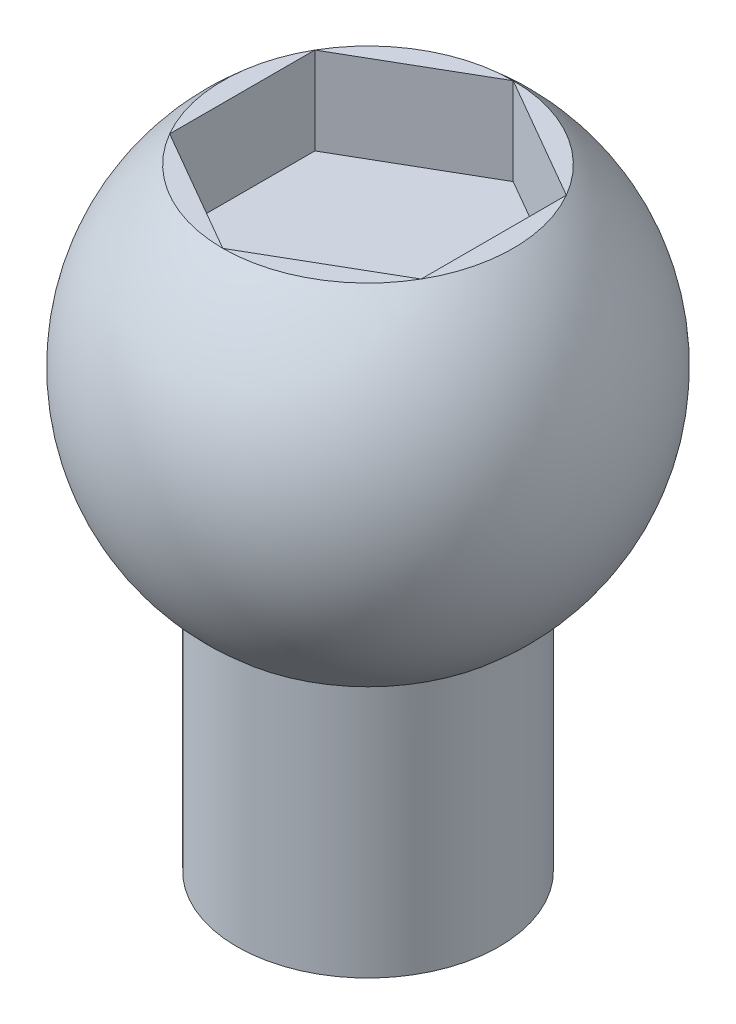
ISO-10303-21;
HEADER;
FILE_DESCRIPTION(('STEP AP214'),'2;1');
FILE_NAME('part.step','',(''),(''),'','','');
FILE_SCHEMA(('AUTOMOTIVE_DESIGN { 1 0 10303 214 1 1 1 1 }'));
ENDSEC;
DATA;
#1=APPLICATION_CONTEXT('core data for automotive mechanical design processes');
#2=APPLICATION_PROTOCOL_DEFINITION('international standard','automotive_design',2000,#1);
#3=PRODUCT_CONTEXT('',#1,'mechanical');
#4=PRODUCT('Part','Part','',(#3));
#5=PRODUCT_RELATED_PRODUCT_CATEGORY('part','',(#4));
#6=PRODUCT_DEFINITION_FORMATION('','',#4);
#7=PRODUCT_DEFINITION_CONTEXT('part definition',#1,'design');
#8=PRODUCT_DEFINITION('design','',#6,#7);
#9=PRODUCT_DEFINITION_SHAPE('','',#8);
#10=(LENGTH_UNIT() NAMED_UNIT(*) SI_UNIT(.MILLI.,.METRE.));
#11=(NAMED_UNIT(*) PLANE_ANGLE_UNIT() SI_UNIT($,.RADIAN.));
#12=(NAMED_UNIT(*) SI_UNIT($,.STERADIAN.) SOLID_ANGLE_UNIT());
#13=UNCERTAINTY_MEASURE_WITH_UNIT(LENGTH_MEASURE(1.E-05),#10,'distance_accuracy_value','');
#14=(GEOMETRIC_REPRESENTATION_CONTEXT(3) GLOBAL_UNCERTAINTY_ASSIGNED_CONTEXT((#13)) GLOBAL_UNIT_ASSIGNED_CONTEXT((#10,
#11,#12)) REPRESENTATION_CONTEXT('',''));
#15=CARTESIAN_POINT('',(0.,0.,0.));
#16=DIRECTION('',(0.,0.,1.));
#17=DIRECTION('',(1.,0.,0.));
#18=AXIS2_PLACEMENT_3D('',#15,#16,#17);
#19=CARTESIAN_POINT('',(0.,2.,0.));
#20=DIRECTION('',(0.,1.,0.));
#21=DIRECTION('',(0.,0.,1.));
#22=AXIS2_PLACEMENT_3D('',#19,#20,#21);
#23=PLANE('',#22);
#24=DIRECTION('',(0.86602540378444,0.,0.499999999999998));
#25=VECTOR('',#24,1.);
#26=CARTESIAN_POINT('',(0.,2.,1.66132477258361));
#27=LINE('',#26,#25);
#28=CARTESIAN_POINT('',(-1.43874945699382,2.,0.830662386291809));
#29=VERTEX_POINT('',#28);
#30=CARTESIAN_POINT('',(0.,2.,1.66132477258361));
#31=VERTEX_POINT('',#30);
#32=EDGE_CURVE('E52',#29,#31,#27,.T.);
#33=ORIENTED_EDGE('',*,*,#32,.F.);
#34=CARTESIAN_POINT('',(0.,2.,0.));
#35=DIRECTION('',(0.,1.,0.));
#36=DIRECTION('',(0.,0.,1.));
#37=AXIS2_PLACEMENT_3D('',#34,#35,#36);
#38=CIRCLE('',#37,1.66132477258361);
#39=EDGE_CURVE('E44',#31,#29,#38,.F.);
#40=ORIENTED_EDGE('',*,*,#39,.F.);
#41=EDGE_LOOP('',(#33,#40));
#42=FACE_BOUND('',#41,.T.);
#43=ADVANCED_FACE('F35',(#42),#23,.T.);
#44=DIRECTION('',(0.,0.,1.));
#45=VECTOR('',#44,1.);
#46=CARTESIAN_POINT('',(-1.43874945699382,2.,0.830662386291809));
#47=LINE('',#46,#45);
#48=CARTESIAN_POINT('',(-1.43874945699382,2.,-0.830662386291809));
#49=VERTEX_POINT('',#48);
#50=EDGE_CURVE('E135',#49,#29,#47,.T.);
#51=ORIENTED_EDGE('',*,*,#50,.F.);
#52=EDGE_CURVE('E182',#29,#49,#38,.F.);
#53=ORIENTED_EDGE('',*,*,#52,.F.);
#54=EDGE_LOOP('',(#51,#53));
#55=FACE_BOUND('',#54,.T.);
#56=ADVANCED_FACE('F169',(#55),#23,.T.);
#57=DIRECTION('',(-0.86602540378444,0.,0.499999999999998));
#58=VECTOR('',#57,1.);
#59=CARTESIAN_POINT('',(-1.43874945699382,2.,-0.830662386291809));
#60=LINE('',#59,#58);
#61=CARTESIAN_POINT('',(0.,2.,-1.66132477258361));
#62=VERTEX_POINT('',#61);
#63=EDGE_CURVE('E133',#62,#49,#60,.T.);
#64=ORIENTED_EDGE('',*,*,#63,.F.);
#65=EDGE_CURVE('E185',#49,#62,#38,.F.);
#66=ORIENTED_EDGE('',*,*,#65,.F.);
#67=EDGE_LOOP('',(#64,#66));
#68=FACE_BOUND('',#67,.T.);
#69=ADVANCED_FACE('F175',(#68),#23,.T.);
#70=DIRECTION('',(-0.86602540378444,0.,-0.499999999999998));
#71=VECTOR('',#70,1.);
#72=CARTESIAN_POINT('',(0.,2.,-1.66132477258361));
#73=LINE('',#72,#71);
#74=CARTESIAN_POINT('',(1.43874945699382,2.,-0.830662386291809));
#75=VERTEX_POINT('',#74);
#76=EDGE_CURVE('E100',#75,#62,#73,.T.);
#77=ORIENTED_EDGE('',*,*,#76,.F.);
#78=EDGE_CURVE('E192',#62,#75,#38,.F.);
#79=ORIENTED_EDGE('',*,*,#78,.F.);
#80=EDGE_LOOP('',(#77,#79));
#81=FACE_BOUND('',#80,.T.);
#82=ADVANCED_FACE('F271',(#81),#23,.T.);
#83=DIRECTION('',(0.,0.,-1.));
#84=VECTOR('',#83,1.);
#85=CARTESIAN_POINT('',(1.43874945699382,2.,-0.830662386291809));
#86=LINE('',#85,#84);
#87=CARTESIAN_POINT('',(1.43874945699382,2.,0.830662386291809));
#88=VERTEX_POINT('',#87);
#89=EDGE_CURVE('E129',#88,#75,#86,.T.);
#90=ORIENTED_EDGE('',*,*,#89,.F.);
#91=EDGE_CURVE('E191',#75,#88,#38,.F.);
#92=ORIENTED_EDGE('',*,*,#91,.F.);
#93=EDGE_LOOP('',(#90,#92));
#94=FACE_BOUND('',#93,.T.);
#95=ADVANCED_FACE('F155',(#94),#23,.T.);
#96=DIRECTION('',(0.86602540378444,0.,-0.499999999999998));
#97=VECTOR('',#96,1.);
#98=CARTESIAN_POINT('',(1.43874945699382,2.,0.830662386291809));
#99=LINE('',#98,#97);
#100=EDGE_CURVE('E126',#31,#88,#99,.T.);
#101=ORIENTED_EDGE('',*,*,#100,.F.);
#102=EDGE_CURVE('E190',#88,#31,#38,.F.);
#103=ORIENTED_EDGE('',*,*,#102,.F.);
#104=EDGE_LOOP('',(#101,#103));
#105=FACE_BOUND('',#104,.T.);
#106=ADVANCED_FACE('F37',(#105),#23,.T.);
#107=CARTESIAN_POINT('',(0.,-2.,0.));
#108=DIRECTION('',(0.,-1.,0.));
#109=DIRECTION('',(0.,0.,-1.));
#110=AXIS2_PLACEMENT_3D('',#107,#108,#109);
#111=PLANE('',#110);
#112=CARTESIAN_POINT('',(0.,-2.,0.));
#113=DIRECTION('',(0.,-1.,0.));
#114=DIRECTION('',(0.,0.,-1.));
#115=AXIS2_PLACEMENT_3D('',#112,#113,#114);
#116=CIRCLE('',#115,1.5);
#117=CARTESIAN_POINT('',(0.,-2.,-1.5));
#118=VERTEX_POINT('',#117);
#119=EDGE_CURVE('E39',#118,#118,#116,.F.);
#120=ORIENTED_EDGE('',*,*,#119,.T.);
#121=EDGE_LOOP('',(#120));
#122=FACE_BOUND('',#121,.T.);
#123=CARTESIAN_POINT('',(0.,-2.,0.));
#124=DIRECTION('',(0.,1.,0.));
#125=DIRECTION('',(0.,0.,1.));
#126=AXIS2_PLACEMENT_3D('',#123,#124,#125);
#127=CIRCLE('',#126,1.66132477258362);
#128=CARTESIAN_POINT('',(0.,-2.,1.66132477258362));
#129=VERTEX_POINT('',#128);
#130=EDGE_CURVE('E11',#129,#129,#127,.T.);
#131=ORIENTED_EDGE('',*,*,#130,.F.);
#132=EDGE_LOOP('',(#131));
#133=FACE_BOUND('',#132,.T.);
#134=ADVANCED_FACE('F153',(#122,#133),#111,.T.);
#135=CARTESIAN_POINT('',(0.,0.,0.));
#136=DIRECTION('',(0.,1.,0.));
#137=DIRECTION('',(-1.,0.,0.));
#138=AXIS2_PLACEMENT_3D('',#135,#136,#137);
#139=SPHERICAL_SURFACE('',#138,2.6);
#140=ORIENTED_EDGE('',*,*,#39,.T.);
#141=ORIENTED_EDGE('',*,*,#52,.T.);
#142=ORIENTED_EDGE('',*,*,#65,.T.);
#143=ORIENTED_EDGE('',*,*,#78,.T.);
#144=ORIENTED_EDGE('',*,*,#91,.T.);
#145=ORIENTED_EDGE('',*,*,#102,.T.);
#146=EDGE_LOOP('',(#140,#141,#142,#143,#144,#145));
#147=FACE_BOUND('',#146,.T.);
#148=ORIENTED_EDGE('',*,*,#130,.T.);
#149=EDGE_LOOP('',(#148));
#150=FACE_BOUND('',#149,.T.);
#151=ADVANCED_FACE('F149',(#147,#150),#139,.T.);
#152=CARTESIAN_POINT('',(0.,2.,0.));
#153=DIRECTION('',(0.,1.,0.));
#154=DIRECTION('',(0.,0.,1.));
#155=AXIS2_PLACEMENT_3D('',#152,#153,#154);
#156=CYLINDRICAL_SURFACE('',#155,1.5);
#157=ORIENTED_EDGE('',*,*,#119,.F.);
#158=EDGE_LOOP('',(#157));
#159=FACE_BOUND('',#158,.T.);
#160=CARTESIAN_POINT('',(0.,-5.,0.));
#161=DIRECTION('',(0.,1.,0.));
#162=DIRECTION('',(0.,0.,1.));
#163=AXIS2_PLACEMENT_3D('',#160,#161,#162);
#164=CIRCLE('',#163,1.5);
#165=CARTESIAN_POINT('',(0.,-5.,1.5));
#166=VERTEX_POINT('',#165);
#167=EDGE_CURVE('E139',#166,#166,#164,.T.);
#168=ORIENTED_EDGE('',*,*,#167,.T.);
#169=EDGE_LOOP('',(#168));
#170=FACE_BOUND('',#169,.T.);
#171=ADVANCED_FACE('F152',(#159,#170),#156,.T.);
#172=CARTESIAN_POINT('',(0.,-5.,0.));
#173=DIRECTION('',(0.,1.,0.));
#174=DIRECTION('',(0.,0.,1.));
#175=AXIS2_PLACEMENT_3D('',#172,#173,#174);
#176=PLANE('',#175);
#177=ORIENTED_EDGE('',*,*,#167,.F.);
#178=EDGE_LOOP('',(#177));
#179=FACE_BOUND('',#178,.T.);
#180=ADVANCED_FACE('F156',(#179),#176,.F.);
#181=CARTESIAN_POINT('',(0.,1.,1.66132477258361));
#182=DIRECTION('',(-0.499999999999998,0.,0.86602540378444));
#183=DIRECTION('',(0.86602540378444,0.,0.499999999999998));
#184=AXIS2_PLACEMENT_3D('',#181,#182,#183);
#185=PLANE('',#184);
#186=ORIENTED_EDGE('',*,*,#32,.T.);
#187=DIRECTION('',(0.,1.,0.));
#188=VECTOR('',#187,1.);
#189=CARTESIAN_POINT('',(0.,1.,1.66132477258361));
#190=LINE('',#189,#188);
#191=CARTESIAN_POINT('',(0.,1.,1.66132477258361));
#192=VERTEX_POINT('',#191);
#193=EDGE_CURVE('E82',#192,#31,#190,.T.);
#194=ORIENTED_EDGE('',*,*,#193,.F.);
#195=DIRECTION('',(0.86602540378444,0.,0.499999999999998));
#196=VECTOR('',#195,1.);
#197=CARTESIAN_POINT('',(0.,1.,1.66132477258361));
#198=LINE('',#197,#196);
#199=CARTESIAN_POINT('',(-1.43874945699382,1.,0.830662386291809));
#200=VERTEX_POINT('',#199);
#201=EDGE_CURVE('E137',#200,#192,#198,.T.);
#202=ORIENTED_EDGE('',*,*,#201,.F.);
#203=DIRECTION('',(0.,1.,0.));
#204=VECTOR('',#203,1.);
#205=CARTESIAN_POINT('',(-1.43874945699382,1.,0.830662386291809));
#206=LINE('',#205,#204);
#207=EDGE_CURVE('E60',#200,#29,#206,.T.);
#208=ORIENTED_EDGE('',*,*,#207,.T.);
#209=EDGE_LOOP('',(#186,#194,#202,#208));
#210=FACE_BOUND('',#209,.T.);
#211=ADVANCED_FACE('F200',(#210),#185,.F.);
#212=CARTESIAN_POINT('',(-1.43874945699382,1.,0.830662386291809));
#213=DIRECTION('',(-1.,0.,0.));
#214=DIRECTION('',(0.,0.,1.));
#215=AXIS2_PLACEMENT_3D('',#212,#213,#214);
#216=PLANE('',#215);
#217=ORIENTED_EDGE('',*,*,#50,.T.);
#218=ORIENTED_EDGE('',*,*,#207,.F.);
#219=DIRECTION('',(0.,0.,1.));
#220=VECTOR('',#219,1.);
#221=CARTESIAN_POINT('',(-1.43874945699382,1.,0.830662386291809));
#222=LINE('',#221,#220);
#223=CARTESIAN_POINT('',(-1.43874945699382,1.,-0.830662386291809));
#224=VERTEX_POINT('',#223);
#225=EDGE_CURVE('E112',#224,#200,#222,.T.);
#226=ORIENTED_EDGE('',*,*,#225,.F.);
#227=DIRECTION('',(0.,1.,0.));
#228=VECTOR('',#227,1.);
#229=CARTESIAN_POINT('',(-1.43874945699382,1.,-0.830662386291809));
#230=LINE('',#229,#228);
#231=EDGE_CURVE('E104',#224,#49,#230,.T.);
#232=ORIENTED_EDGE('',*,*,#231,.T.);
#233=EDGE_LOOP('',(#217,#218,#226,#232));
#234=FACE_BOUND('',#233,.T.);
#235=ADVANCED_FACE('F204',(#234),#216,.F.);
#236=CARTESIAN_POINT('',(-1.43874945699382,1.,-0.830662386291809));
#237=DIRECTION('',(-0.499999999999998,0.,-0.86602540378444));
#238=DIRECTION('',(-0.86602540378444,0.,0.499999999999998));
#239=AXIS2_PLACEMENT_3D('',#236,#237,#238);
#240=PLANE('',#239);
#241=ORIENTED_EDGE('',*,*,#63,.T.);
#242=ORIENTED_EDGE('',*,*,#231,.F.);
#243=DIRECTION('',(-0.86602540378444,0.,0.499999999999998));
#244=VECTOR('',#243,1.);
#245=CARTESIAN_POINT('',(-1.43874945699382,1.,-0.830662386291809));
#246=LINE('',#245,#244);
#247=CARTESIAN_POINT('',(0.,1.,-1.66132477258361));
#248=VERTEX_POINT('',#247);
#249=EDGE_CURVE('E108',#248,#224,#246,.T.);
#250=ORIENTED_EDGE('',*,*,#249,.F.);
#251=DIRECTION('',(0.,1.,0.));
#252=VECTOR('',#251,1.);
#253=CARTESIAN_POINT('',(0.,1.,-1.66132477258361));
#254=LINE('',#253,#252);
#255=EDGE_CURVE('E93',#248,#62,#254,.T.);
#256=ORIENTED_EDGE('',*,*,#255,.T.);
#257=EDGE_LOOP('',(#241,#242,#250,#256));
#258=FACE_BOUND('',#257,.T.);
#259=ADVANCED_FACE('F109',(#258),#240,.F.);
#260=CARTESIAN_POINT('',(0.,1.,-1.66132477258361));
#261=DIRECTION('',(0.499999999999998,0.,-0.86602540378444));
#262=DIRECTION('',(-0.86602540378444,0.,-0.499999999999998));
#263=AXIS2_PLACEMENT_3D('',#260,#261,#262);
#264=PLANE('',#263);
#265=ORIENTED_EDGE('',*,*,#76,.T.);
#266=ORIENTED_EDGE('',*,*,#255,.F.);
#267=DIRECTION('',(-0.86602540378444,0.,-0.499999999999998));
#268=VECTOR('',#267,1.);
#269=CARTESIAN_POINT('',(0.,1.,-1.66132477258361));
#270=LINE('',#269,#268);
#271=CARTESIAN_POINT('',(1.43874945699382,1.,-0.830662386291809));
#272=VERTEX_POINT('',#271);
#273=EDGE_CURVE('E97',#272,#248,#270,.T.);
#274=ORIENTED_EDGE('',*,*,#273,.F.);
#275=DIRECTION('',(0.,1.,0.));
#276=VECTOR('',#275,1.);
#277=CARTESIAN_POINT('',(1.43874945699382,1.,-0.830662386291809));
#278=LINE('',#277,#276);
#279=EDGE_CURVE('E105',#272,#75,#278,.T.);
#280=ORIENTED_EDGE('',*,*,#279,.T.);
#281=EDGE_LOOP('',(#265,#266,#274,#280));
#282=FACE_BOUND('',#281,.T.);
#283=ADVANCED_FACE('F95',(#282),#264,.F.);
#284=CARTESIAN_POINT('',(1.43874945699382,1.,-0.830662386291809));
#285=DIRECTION('',(1.,0.,0.));
#286=DIRECTION('',(0.,0.,-1.));
#287=AXIS2_PLACEMENT_3D('',#284,#285,#286);
#288=PLANE('',#287);
#289=ORIENTED_EDGE('',*,*,#89,.T.);
#290=ORIENTED_EDGE('',*,*,#279,.F.);
#291=DIRECTION('',(0.,0.,-1.));
#292=VECTOR('',#291,1.);
#293=CARTESIAN_POINT('',(1.43874945699382,1.,-0.830662386291809));
#294=LINE('',#293,#292);
#295=CARTESIAN_POINT('',(1.43874945699382,1.,0.830662386291809));
#296=VERTEX_POINT('',#295);
#297=EDGE_CURVE('E118',#296,#272,#294,.T.);
#298=ORIENTED_EDGE('',*,*,#297,.F.);
#299=DIRECTION('',(0.,1.,0.));
#300=VECTOR('',#299,1.);
#301=CARTESIAN_POINT('',(1.43874945699382,1.,0.830662386291809));
#302=LINE('',#301,#300);
#303=EDGE_CURVE('E142',#296,#88,#302,.T.);
#304=ORIENTED_EDGE('',*,*,#303,.T.);
#305=EDGE_LOOP('',(#289,#290,#298,#304));
#306=FACE_BOUND('',#305,.T.);
#307=ADVANCED_FACE('F214',(#306),#288,.F.);
#308=CARTESIAN_POINT('',(1.43874945699382,1.,0.830662386291809));
#309=DIRECTION('',(0.499999999999998,0.,0.86602540378444));
#310=DIRECTION('',(0.86602540378444,0.,-0.499999999999998));
#311=AXIS2_PLACEMENT_3D('',#308,#309,#310);
#312=PLANE('',#311);
#313=ORIENTED_EDGE('',*,*,#100,.T.);
#314=ORIENTED_EDGE('',*,*,#303,.F.);
#315=DIRECTION('',(0.86602540378444,0.,-0.499999999999998));
#316=VECTOR('',#315,1.);
#317=CARTESIAN_POINT('',(1.43874945699382,1.,0.830662386291809));
#318=LINE('',#317,#316);
#319=EDGE_CURVE('E120',#192,#296,#318,.T.);
#320=ORIENTED_EDGE('',*,*,#319,.F.);
#321=ORIENTED_EDGE('',*,*,#193,.T.);
#322=EDGE_LOOP('',(#313,#314,#320,#321));
#323=FACE_BOUND('',#322,.T.);
#324=ADVANCED_FACE('F211',(#323),#312,.F.);
#325=CARTESIAN_POINT('',(0.,1.,0.));
#326=DIRECTION('',(0.,-1.,0.));
#327=DIRECTION('',(0.,0.,-1.));
#328=AXIS2_PLACEMENT_3D('',#325,#326,#327);
#329=PLANE('',#328);
#330=ORIENTED_EDGE('',*,*,#201,.T.);
#331=ORIENTED_EDGE('',*,*,#319,.T.);
#332=ORIENTED_EDGE('',*,*,#297,.T.);
#333=ORIENTED_EDGE('',*,*,#273,.T.);
#334=ORIENTED_EDGE('',*,*,#249,.T.);
#335=ORIENTED_EDGE('',*,*,#225,.T.);
#336=EDGE_LOOP('',(#330,#331,#332,#333,#334,#335));
#337=FACE_BOUND('',#336,.T.);
#338=ADVANCED_FACE('F115',(#337),#329,.F.);
#339=CLOSED_SHELL('',(#43,#56,#69,#82,#95,#106,#134,#151,#171,#180,#211,#235,#259,#283,#307,
#324,#338));
#340=MANIFOLD_SOLID_BREP('B2',#339);
#341=ADVANCED_BREP_SHAPE_REPRESENTATION('',(#18,#340),#14);
#342=SHAPE_DEFINITION_REPRESENTATION(#9,#341);
ENDSEC;
END-ISO-10303-21;
